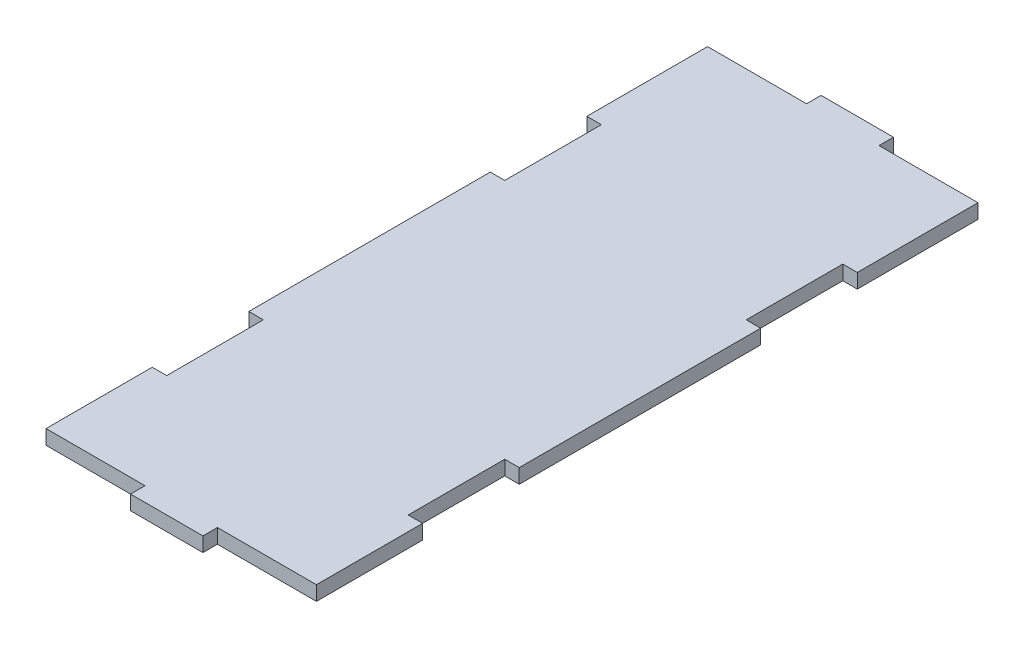
ISO-10303-21;
HEADER;
FILE_DESCRIPTION(('STEP AP214'),'2;1');
FILE_NAME('part.step','',(''),(''),'','','');
FILE_SCHEMA(('AUTOMOTIVE_DESIGN { 1 0 10303 214 1 1 1 1 }'));
ENDSEC;
DATA;
#1=APPLICATION_CONTEXT('core data for automotive mechanical design processes');
#2=APPLICATION_PROTOCOL_DEFINITION('international standard','automotive_design',2000,#1);
#3=PRODUCT_CONTEXT('',#1,'mechanical');
#4=PRODUCT('Part','Part','',(#3));
#5=PRODUCT_RELATED_PRODUCT_CATEGORY('part','',(#4));
#6=PRODUCT_DEFINITION_FORMATION('','',#4);
#7=PRODUCT_DEFINITION_CONTEXT('part definition',#1,'design');
#8=PRODUCT_DEFINITION('design','',#6,#7);
#9=PRODUCT_DEFINITION_SHAPE('','',#8);
#10=(LENGTH_UNIT() NAMED_UNIT(*) SI_UNIT(.MILLI.,.METRE.));
#11=(NAMED_UNIT(*) PLANE_ANGLE_UNIT() SI_UNIT($,.RADIAN.));
#12=(NAMED_UNIT(*) SI_UNIT($,.STERADIAN.) SOLID_ANGLE_UNIT());
#13=UNCERTAINTY_MEASURE_WITH_UNIT(LENGTH_MEASURE(1.E-05),#10,'distance_accuracy_value','');
#14=(GEOMETRIC_REPRESENTATION_CONTEXT(3) GLOBAL_UNCERTAINTY_ASSIGNED_CONTEXT((#13)) GLOBAL_UNIT_ASSIGNED_CONTEXT((#10,
#11,#12)) REPRESENTATION_CONTEXT('',''));
#15=CARTESIAN_POINT('',(0.,0.,0.));
#16=DIRECTION('',(0.,0.,1.));
#17=DIRECTION('',(1.,0.,0.));
#18=AXIS2_PLACEMENT_3D('',#15,#16,#17);
#19=CARTESIAN_POINT('',(-7.50000000000006,91.,0.));
#20=DIRECTION('',(0.,0.,-1.));
#21=DIRECTION('',(-1.,0.,0.));
#22=AXIS2_PLACEMENT_3D('',#19,#20,#21);
#23=PLANE('',#22);
#24=DIRECTION('',(1.,0.,0.));
#25=VECTOR('',#24,1.);
#26=CARTESIAN_POINT('',(-7.50000000000006,88.,0.));
#27=LINE('',#26,#25);
#28=CARTESIAN_POINT('',(-7.50000000000006,88.,0.));
#29=VERTEX_POINT('',#28);
#30=CARTESIAN_POINT('',(7.49999999999994,88.,0.));
#31=VERTEX_POINT('',#30);
#32=EDGE_CURVE('E248',#29,#31,#27,.T.);
#33=ORIENTED_EDGE('',*,*,#32,.T.);
#34=DIRECTION('',(0.,-1.,0.));
#35=VECTOR('',#34,1.);
#36=CARTESIAN_POINT('',(7.49999999999994,91.,0.));
#37=LINE('',#36,#35);
#38=CARTESIAN_POINT('',(7.49999999999994,91.,0.));
#39=VERTEX_POINT('',#38);
#40=EDGE_CURVE('E11',#39,#31,#37,.T.);
#41=ORIENTED_EDGE('',*,*,#40,.F.);
#42=DIRECTION('',(1.,0.,0.));
#43=VECTOR('',#42,1.);
#44=CARTESIAN_POINT('',(-7.50000000000006,91.,0.));
#45=LINE('',#44,#43);
#46=CARTESIAN_POINT('',(-7.50000000000006,91.,0.));
#47=VERTEX_POINT('',#46);
#48=EDGE_CURVE('E302',#47,#39,#45,.T.);
#49=ORIENTED_EDGE('',*,*,#48,.F.);
#50=DIRECTION('',(0.,-1.,0.));
#51=VECTOR('',#50,1.);
#52=CARTESIAN_POINT('',(-7.50000000000006,91.,0.));
#53=LINE('',#52,#51);
#54=EDGE_CURVE('E244',#47,#29,#53,.T.);
#55=ORIENTED_EDGE('',*,*,#54,.T.);
#56=EDGE_LOOP('',(#33,#41,#49,#55));
#57=FACE_BOUND('',#56,.T.);
#58=ADVANCED_FACE('F32',(#57),#23,.F.);
#59=CARTESIAN_POINT('',(7.49999999999994,91.,-3.));
#60=DIRECTION('',(-1.,0.,0.));
#61=DIRECTION('',(0.,-1.,0.));
#62=AXIS2_PLACEMENT_3D('',#59,#60,#61);
#63=PLANE('',#62);
#64=DIRECTION('',(0.,0.,-1.));
#65=VECTOR('',#64,1.);
#66=CARTESIAN_POINT('',(7.49999999999994,88.,-3.));
#67=LINE('',#66,#65);
#68=CARTESIAN_POINT('',(7.49999999999994,88.,-3.));
#69=VERTEX_POINT('',#68);
#70=EDGE_CURVE('E251',#31,#69,#67,.T.);
#71=ORIENTED_EDGE('',*,*,#70,.T.);
#72=DIRECTION('',(0.,-1.,0.));
#73=VECTOR('',#72,1.);
#74=CARTESIAN_POINT('',(7.49999999999994,91.,-3.));
#75=LINE('',#74,#73);
#76=CARTESIAN_POINT('',(7.49999999999994,91.,-3.));
#77=VERTEX_POINT('',#76);
#78=EDGE_CURVE('E40',#77,#69,#75,.T.);
#79=ORIENTED_EDGE('',*,*,#78,.F.);
#80=DIRECTION('',(0.,0.,-1.));
#81=VECTOR('',#80,1.);
#82=CARTESIAN_POINT('',(7.49999999999994,91.,-3.));
#83=LINE('',#82,#81);
#84=EDGE_CURVE('E151',#39,#77,#83,.T.);
#85=ORIENTED_EDGE('',*,*,#84,.F.);
#86=ORIENTED_EDGE('',*,*,#40,.T.);
#87=EDGE_LOOP('',(#71,#79,#85,#86));
#88=FACE_BOUND('',#87,.T.);
#89=ADVANCED_FACE('F460',(#88),#63,.F.);
#90=CARTESIAN_POINT('',(27.9999999999999,91.,-3.));
#91=DIRECTION('',(0.,0.,-1.));
#92=DIRECTION('',(-1.,0.,0.));
#93=AXIS2_PLACEMENT_3D('',#90,#91,#92);
#94=PLANE('',#93);
#95=DIRECTION('',(1.,0.,0.));
#96=VECTOR('',#95,1.);
#97=CARTESIAN_POINT('',(27.9999999999999,88.,-3.));
#98=LINE('',#97,#96);
#99=CARTESIAN_POINT('',(27.9999999999999,88.,-3.));
#100=VERTEX_POINT('',#99);
#101=EDGE_CURVE('E253',#69,#100,#98,.T.);
#102=ORIENTED_EDGE('',*,*,#101,.T.);
#103=DIRECTION('',(0.,-1.,0.));
#104=VECTOR('',#103,1.);
#105=CARTESIAN_POINT('',(27.9999999999999,91.,-3.));
#106=LINE('',#105,#104);
#107=CARTESIAN_POINT('',(27.9999999999999,91.,-3.));
#108=VERTEX_POINT('',#107);
#109=EDGE_CURVE('E369',#108,#100,#106,.T.);
#110=ORIENTED_EDGE('',*,*,#109,.F.);
#111=DIRECTION('',(1.,0.,0.));
#112=VECTOR('',#111,1.);
#113=CARTESIAN_POINT('',(27.9999999999999,91.,-3.));
#114=LINE('',#113,#112);
#115=EDGE_CURVE('E377',#77,#108,#114,.T.);
#116=ORIENTED_EDGE('',*,*,#115,.F.);
#117=ORIENTED_EDGE('',*,*,#78,.T.);
#118=EDGE_LOOP('',(#102,#110,#116,#117));
#119=FACE_BOUND('',#118,.T.);
#120=ADVANCED_FACE('F375',(#119),#94,.F.);
#121=CARTESIAN_POINT('',(27.9999999999999,91.,-3.));
#122=DIRECTION('',(-1.,0.,0.));
#123=DIRECTION('',(0.,-1.,0.));
#124=AXIS2_PLACEMENT_3D('',#121,#122,#123);
#125=PLANE('',#124);
#126=DIRECTION('',(0.,0.,-1.));
#127=VECTOR('',#126,1.);
#128=CARTESIAN_POINT('',(27.9999999999999,88.,-3.));
#129=LINE('',#128,#127);
#130=CARTESIAN_POINT('',(27.9999999999999,88.,-25.));
#131=VERTEX_POINT('',#130);
#132=EDGE_CURVE('E255',#100,#131,#129,.T.);
#133=ORIENTED_EDGE('',*,*,#132,.T.);
#134=DIRECTION('',(0.,-1.,0.));
#135=VECTOR('',#134,1.);
#136=CARTESIAN_POINT('',(27.9999999999999,91.,-25.));
#137=LINE('',#136,#135);
#138=CARTESIAN_POINT('',(27.9999999999999,91.,-25.));
#139=VERTEX_POINT('',#138);
#140=EDGE_CURVE('E366',#139,#131,#137,.T.);
#141=ORIENTED_EDGE('',*,*,#140,.F.);
#142=DIRECTION('',(0.,0.,-1.));
#143=VECTOR('',#142,1.);
#144=CARTESIAN_POINT('',(27.9999999999999,91.,-3.));
#145=LINE('',#144,#143);
#146=EDGE_CURVE('E395',#108,#139,#145,.T.);
#147=ORIENTED_EDGE('',*,*,#146,.F.);
#148=ORIENTED_EDGE('',*,*,#109,.T.);
#149=EDGE_LOOP('',(#133,#141,#147,#148));
#150=FACE_BOUND('',#149,.T.);
#151=ADVANCED_FACE('F386',(#150),#125,.F.);
#152=CARTESIAN_POINT('',(24.9999999999999,91.,-25.));
#153=DIRECTION('',(0.,0.,1.));
#154=DIRECTION('',(1.,0.,0.));
#155=AXIS2_PLACEMENT_3D('',#152,#153,#154);
#156=PLANE('',#155);
#157=DIRECTION('',(-1.,0.,0.));
#158=VECTOR('',#157,1.);
#159=CARTESIAN_POINT('',(24.9999999999999,88.,-25.));
#160=LINE('',#159,#158);
#161=CARTESIAN_POINT('',(24.9999999999999,88.,-25.));
#162=VERTEX_POINT('',#161);
#163=EDGE_CURVE('E257',#131,#162,#160,.T.);
#164=ORIENTED_EDGE('',*,*,#163,.T.);
#165=DIRECTION('',(0.,-1.,0.));
#166=VECTOR('',#165,1.);
#167=CARTESIAN_POINT('',(24.9999999999999,91.,-25.));
#168=LINE('',#167,#166);
#169=CARTESIAN_POINT('',(24.9999999999999,91.,-25.));
#170=VERTEX_POINT('',#169);
#171=EDGE_CURVE('E363',#170,#162,#168,.T.);
#172=ORIENTED_EDGE('',*,*,#171,.F.);
#173=DIRECTION('',(-1.,0.,0.));
#174=VECTOR('',#173,1.);
#175=CARTESIAN_POINT('',(24.9999999999999,91.,-25.));
#176=LINE('',#175,#174);
#177=EDGE_CURVE('E392',#139,#170,#176,.T.);
#178=ORIENTED_EDGE('',*,*,#177,.F.);
#179=ORIENTED_EDGE('',*,*,#140,.T.);
#180=EDGE_LOOP('',(#164,#172,#178,#179));
#181=FACE_BOUND('',#180,.T.);
#182=ADVANCED_FACE('F390',(#181),#156,.F.);
#183=CARTESIAN_POINT('',(24.9999999999999,91.,-45.));
#184=DIRECTION('',(-1.,0.,0.));
#185=DIRECTION('',(0.,0.,1.));
#186=AXIS2_PLACEMENT_3D('',#183,#184,#185);
#187=PLANE('',#186);
#188=DIRECTION('',(0.,0.,-1.));
#189=VECTOR('',#188,1.);
#190=CARTESIAN_POINT('',(24.9999999999999,88.,-45.));
#191=LINE('',#190,#189);
#192=CARTESIAN_POINT('',(24.9999999999999,88.,-45.));
#193=VERTEX_POINT('',#192);
#194=EDGE_CURVE('E259',#162,#193,#191,.T.);
#195=ORIENTED_EDGE('',*,*,#194,.T.);
#196=DIRECTION('',(0.,-1.,0.));
#197=VECTOR('',#196,1.);
#198=CARTESIAN_POINT('',(24.9999999999999,91.,-45.));
#199=LINE('',#198,#197);
#200=CARTESIAN_POINT('',(24.9999999999999,91.,-45.));
#201=VERTEX_POINT('',#200);
#202=EDGE_CURVE('E360',#201,#193,#199,.T.);
#203=ORIENTED_EDGE('',*,*,#202,.F.);
#204=DIRECTION('',(0.,0.,-1.));
#205=VECTOR('',#204,1.);
#206=CARTESIAN_POINT('',(24.9999999999999,91.,-45.));
#207=LINE('',#206,#205);
#208=EDGE_CURVE('E394',#170,#201,#207,.T.);
#209=ORIENTED_EDGE('',*,*,#208,.F.);
#210=ORIENTED_EDGE('',*,*,#171,.T.);
#211=EDGE_LOOP('',(#195,#203,#209,#210));
#212=FACE_BOUND('',#211,.T.);
#213=ADVANCED_FACE('F473',(#212),#187,.F.);
#214=CARTESIAN_POINT('',(27.9999999999999,91.,-45.));
#215=DIRECTION('',(0.,0.,-1.));
#216=DIRECTION('',(-1.,0.,0.));
#217=AXIS2_PLACEMENT_3D('',#214,#215,#216);
#218=PLANE('',#217);
#219=DIRECTION('',(1.,0.,0.));
#220=VECTOR('',#219,1.);
#221=CARTESIAN_POINT('',(27.9999999999999,88.,-45.));
#222=LINE('',#221,#220);
#223=CARTESIAN_POINT('',(27.9999999999999,88.,-45.));
#224=VERTEX_POINT('',#223);
#225=EDGE_CURVE('E261',#193,#224,#222,.T.);
#226=ORIENTED_EDGE('',*,*,#225,.T.);
#227=DIRECTION('',(0.,-1.,0.));
#228=VECTOR('',#227,1.);
#229=CARTESIAN_POINT('',(27.9999999999999,91.,-45.));
#230=LINE('',#229,#228);
#231=CARTESIAN_POINT('',(27.9999999999999,91.,-45.));
#232=VERTEX_POINT('',#231);
#233=EDGE_CURVE('E357',#232,#224,#230,.T.);
#234=ORIENTED_EDGE('',*,*,#233,.F.);
#235=DIRECTION('',(1.,0.,0.));
#236=VECTOR('',#235,1.);
#237=CARTESIAN_POINT('',(27.9999999999999,91.,-45.));
#238=LINE('',#237,#236);
#239=EDGE_CURVE('E397',#201,#232,#238,.T.);
#240=ORIENTED_EDGE('',*,*,#239,.F.);
#241=ORIENTED_EDGE('',*,*,#202,.T.);
#242=EDGE_LOOP('',(#226,#234,#240,#241));
#243=FACE_BOUND('',#242,.T.);
#244=ADVANCED_FACE('F476',(#243),#218,.F.);
#245=CARTESIAN_POINT('',(27.9999999999999,91.,-45.));
#246=DIRECTION('',(-1.,0.,0.));
#247=DIRECTION('',(0.,-1.,0.));
#248=AXIS2_PLACEMENT_3D('',#245,#246,#247);
#249=PLANE('',#248);
#250=DIRECTION('',(0.,0.,-1.));
#251=VECTOR('',#250,1.);
#252=CARTESIAN_POINT('',(27.9999999999999,88.,-45.));
#253=LINE('',#252,#251);
#254=CARTESIAN_POINT('',(27.9999999999999,88.,-95.));
#255=VERTEX_POINT('',#254);
#256=EDGE_CURVE('E263',#224,#255,#253,.T.);
#257=ORIENTED_EDGE('',*,*,#256,.T.);
#258=DIRECTION('',(0.,-1.,0.));
#259=VECTOR('',#258,1.);
#260=CARTESIAN_POINT('',(27.9999999999999,91.,-95.));
#261=LINE('',#260,#259);
#262=CARTESIAN_POINT('',(27.9999999999999,91.,-95.));
#263=VERTEX_POINT('',#262);
#264=EDGE_CURVE('E354',#263,#255,#261,.T.);
#265=ORIENTED_EDGE('',*,*,#264,.F.);
#266=DIRECTION('',(0.,0.,-1.));
#267=VECTOR('',#266,1.);
#268=CARTESIAN_POINT('',(27.9999999999999,91.,-45.));
#269=LINE('',#268,#267);
#270=EDGE_CURVE('E403',#232,#263,#269,.T.);
#271=ORIENTED_EDGE('',*,*,#270,.F.);
#272=ORIENTED_EDGE('',*,*,#233,.T.);
#273=EDGE_LOOP('',(#257,#265,#271,#272));
#274=FACE_BOUND('',#273,.T.);
#275=ADVANCED_FACE('F480',(#274),#249,.F.);
#276=CARTESIAN_POINT('',(24.9999999999999,91.,-95.));
#277=DIRECTION('',(0.,0.,1.));
#278=DIRECTION('',(1.,0.,0.));
#279=AXIS2_PLACEMENT_3D('',#276,#277,#278);
#280=PLANE('',#279);
#281=DIRECTION('',(-1.,0.,0.));
#282=VECTOR('',#281,1.);
#283=CARTESIAN_POINT('',(24.9999999999999,88.,-95.));
#284=LINE('',#283,#282);
#285=CARTESIAN_POINT('',(24.9999999999999,88.,-95.));
#286=VERTEX_POINT('',#285);
#287=EDGE_CURVE('E265',#255,#286,#284,.T.);
#288=ORIENTED_EDGE('',*,*,#287,.T.);
#289=DIRECTION('',(0.,-1.,0.));
#290=VECTOR('',#289,1.);
#291=CARTESIAN_POINT('',(24.9999999999999,91.,-95.));
#292=LINE('',#291,#290);
#293=CARTESIAN_POINT('',(24.9999999999999,91.,-95.));
#294=VERTEX_POINT('',#293);
#295=EDGE_CURVE('E351',#294,#286,#292,.T.);
#296=ORIENTED_EDGE('',*,*,#295,.F.);
#297=DIRECTION('',(-1.,0.,0.));
#298=VECTOR('',#297,1.);
#299=CARTESIAN_POINT('',(24.9999999999999,91.,-95.));
#300=LINE('',#299,#298);
#301=EDGE_CURVE('E405',#263,#294,#300,.T.);
#302=ORIENTED_EDGE('',*,*,#301,.F.);
#303=ORIENTED_EDGE('',*,*,#264,.T.);
#304=EDGE_LOOP('',(#288,#296,#302,#303));
#305=FACE_BOUND('',#304,.T.);
#306=ADVANCED_FACE('F484',(#305),#280,.F.);
#307=CARTESIAN_POINT('',(24.9999999999999,91.,-115.));
#308=DIRECTION('',(-1.,0.,0.));
#309=DIRECTION('',(0.,0.,1.));
#310=AXIS2_PLACEMENT_3D('',#307,#308,#309);
#311=PLANE('',#310);
#312=DIRECTION('',(0.,0.,-1.));
#313=VECTOR('',#312,1.);
#314=CARTESIAN_POINT('',(24.9999999999999,88.,-115.));
#315=LINE('',#314,#313);
#316=CARTESIAN_POINT('',(24.9999999999999,88.,-115.));
#317=VERTEX_POINT('',#316);
#318=EDGE_CURVE('E267',#286,#317,#315,.T.);
#319=ORIENTED_EDGE('',*,*,#318,.T.);
#320=DIRECTION('',(0.,-1.,0.));
#321=VECTOR('',#320,1.);
#322=CARTESIAN_POINT('',(24.9999999999999,91.,-115.));
#323=LINE('',#322,#321);
#324=CARTESIAN_POINT('',(24.9999999999999,91.,-115.));
#325=VERTEX_POINT('',#324);
#326=EDGE_CURVE('E348',#325,#317,#323,.T.);
#327=ORIENTED_EDGE('',*,*,#326,.F.);
#328=DIRECTION('',(0.,0.,-1.));
#329=VECTOR('',#328,1.);
#330=CARTESIAN_POINT('',(24.9999999999999,91.,-115.));
#331=LINE('',#330,#329);
#332=EDGE_CURVE('E407',#294,#325,#331,.T.);
#333=ORIENTED_EDGE('',*,*,#332,.F.);
#334=ORIENTED_EDGE('',*,*,#295,.T.);
#335=EDGE_LOOP('',(#319,#327,#333,#334));
#336=FACE_BOUND('',#335,.T.);
#337=ADVANCED_FACE('F488',(#336),#311,.F.);
#338=CARTESIAN_POINT('',(27.9999999999999,91.,-115.));
#339=DIRECTION('',(0.,0.,-1.));
#340=DIRECTION('',(-1.,0.,0.));
#341=AXIS2_PLACEMENT_3D('',#338,#339,#340);
#342=PLANE('',#341);
#343=DIRECTION('',(1.,0.,0.));
#344=VECTOR('',#343,1.);
#345=CARTESIAN_POINT('',(27.9999999999999,88.,-115.));
#346=LINE('',#345,#344);
#347=CARTESIAN_POINT('',(27.9999999999999,88.,-115.));
#348=VERTEX_POINT('',#347);
#349=EDGE_CURVE('E269',#317,#348,#346,.T.);
#350=ORIENTED_EDGE('',*,*,#349,.T.);
#351=DIRECTION('',(0.,-1.,0.));
#352=VECTOR('',#351,1.);
#353=CARTESIAN_POINT('',(27.9999999999999,91.,-115.));
#354=LINE('',#353,#352);
#355=CARTESIAN_POINT('',(27.9999999999999,91.,-115.));
#356=VERTEX_POINT('',#355);
#357=EDGE_CURVE('E345',#356,#348,#354,.T.);
#358=ORIENTED_EDGE('',*,*,#357,.F.);
#359=DIRECTION('',(1.,0.,0.));
#360=VECTOR('',#359,1.);
#361=CARTESIAN_POINT('',(27.9999999999999,91.,-115.));
#362=LINE('',#361,#360);
#363=EDGE_CURVE('E409',#325,#356,#362,.T.);
#364=ORIENTED_EDGE('',*,*,#363,.F.);
#365=ORIENTED_EDGE('',*,*,#326,.T.);
#366=EDGE_LOOP('',(#350,#358,#364,#365));
#367=FACE_BOUND('',#366,.T.);
#368=ADVANCED_FACE('F492',(#367),#342,.F.);
#369=CARTESIAN_POINT('',(27.9999999999999,91.,-115.));
#370=DIRECTION('',(-1.,0.,0.));
#371=DIRECTION('',(0.,-1.,0.));
#372=AXIS2_PLACEMENT_3D('',#369,#370,#371);
#373=PLANE('',#372);
#374=DIRECTION('',(0.,0.,-1.));
#375=VECTOR('',#374,1.);
#376=CARTESIAN_POINT('',(27.9999999999999,88.,-115.));
#377=LINE('',#376,#375);
#378=CARTESIAN_POINT('',(27.9999999999999,88.,-140.));
#379=VERTEX_POINT('',#378);
#380=EDGE_CURVE('E271',#348,#379,#377,.T.);
#381=ORIENTED_EDGE('',*,*,#380,.T.);
#382=DIRECTION('',(0.,-1.,0.));
#383=VECTOR('',#382,1.);
#384=CARTESIAN_POINT('',(27.9999999999999,91.,-140.));
#385=LINE('',#384,#383);
#386=CARTESIAN_POINT('',(27.9999999999999,91.,-140.));
#387=VERTEX_POINT('',#386);
#388=EDGE_CURVE('E342',#387,#379,#385,.T.);
#389=ORIENTED_EDGE('',*,*,#388,.F.);
#390=DIRECTION('',(0.,0.,-1.));
#391=VECTOR('',#390,1.);
#392=CARTESIAN_POINT('',(27.9999999999999,91.,-115.));
#393=LINE('',#392,#391);
#394=EDGE_CURVE('E411',#356,#387,#393,.T.);
#395=ORIENTED_EDGE('',*,*,#394,.F.);
#396=ORIENTED_EDGE('',*,*,#357,.T.);
#397=EDGE_LOOP('',(#381,#389,#395,#396));
#398=FACE_BOUND('',#397,.T.);
#399=ADVANCED_FACE('F496',(#398),#373,.F.);
#400=CARTESIAN_POINT('',(7.49999999999994,91.,-140.));
#401=DIRECTION('',(0.,0.,1.));
#402=DIRECTION('',(1.,0.,0.));
#403=AXIS2_PLACEMENT_3D('',#400,#401,#402);
#404=PLANE('',#403);
#405=DIRECTION('',(-1.,0.,0.));
#406=VECTOR('',#405,1.);
#407=CARTESIAN_POINT('',(7.49999999999994,88.,-140.));
#408=LINE('',#407,#406);
#409=CARTESIAN_POINT('',(7.49999999999994,88.,-140.));
#410=VERTEX_POINT('',#409);
#411=EDGE_CURVE('E273',#379,#410,#408,.T.);
#412=ORIENTED_EDGE('',*,*,#411,.T.);
#413=DIRECTION('',(0.,-1.,0.));
#414=VECTOR('',#413,1.);
#415=CARTESIAN_POINT('',(7.49999999999994,91.,-140.));
#416=LINE('',#415,#414);
#417=CARTESIAN_POINT('',(7.49999999999994,91.,-140.));
#418=VERTEX_POINT('',#417);
#419=EDGE_CURVE('E339',#418,#410,#416,.T.);
#420=ORIENTED_EDGE('',*,*,#419,.F.);
#421=DIRECTION('',(-1.,0.,0.));
#422=VECTOR('',#421,1.);
#423=CARTESIAN_POINT('',(7.49999999999994,91.,-140.));
#424=LINE('',#423,#422);
#425=EDGE_CURVE('E413',#387,#418,#424,.T.);
#426=ORIENTED_EDGE('',*,*,#425,.F.);
#427=ORIENTED_EDGE('',*,*,#388,.T.);
#428=EDGE_LOOP('',(#412,#420,#426,#427));
#429=FACE_BOUND('',#428,.T.);
#430=ADVANCED_FACE('F500',(#429),#404,.F.);
#431=CARTESIAN_POINT('',(7.49999999999994,91.,-143.));
#432=DIRECTION('',(-1.,0.,0.));
#433=DIRECTION('',(0.,-1.,0.));
#434=AXIS2_PLACEMENT_3D('',#431,#432,#433);
#435=PLANE('',#434);
#436=DIRECTION('',(0.,0.,-1.));
#437=VECTOR('',#436,1.);
#438=CARTESIAN_POINT('',(7.49999999999994,88.,-143.));
#439=LINE('',#438,#437);
#440=CARTESIAN_POINT('',(7.49999999999994,88.,-143.));
#441=VERTEX_POINT('',#440);
#442=EDGE_CURVE('E275',#410,#441,#439,.T.);
#443=ORIENTED_EDGE('',*,*,#442,.T.);
#444=DIRECTION('',(0.,-1.,0.));
#445=VECTOR('',#444,1.);
#446=CARTESIAN_POINT('',(7.49999999999994,91.,-143.));
#447=LINE('',#446,#445);
#448=CARTESIAN_POINT('',(7.49999999999994,91.,-143.));
#449=VERTEX_POINT('',#448);
#450=EDGE_CURVE('E336',#449,#441,#447,.T.);
#451=ORIENTED_EDGE('',*,*,#450,.F.);
#452=DIRECTION('',(0.,0.,-1.));
#453=VECTOR('',#452,1.);
#454=CARTESIAN_POINT('',(7.49999999999994,91.,-143.));
#455=LINE('',#454,#453);
#456=EDGE_CURVE('E415',#418,#449,#455,.T.);
#457=ORIENTED_EDGE('',*,*,#456,.F.);
#458=ORIENTED_EDGE('',*,*,#419,.T.);
#459=EDGE_LOOP('',(#443,#451,#457,#458));
#460=FACE_BOUND('',#459,.T.);
#461=ADVANCED_FACE('F504',(#460),#435,.F.);
#462=CARTESIAN_POINT('',(-7.50000000000006,91.,-143.));
#463=DIRECTION('',(0.,0.,1.));
#464=DIRECTION('',(1.,0.,0.));
#465=AXIS2_PLACEMENT_3D('',#462,#463,#464);
#466=PLANE('',#465);
#467=DIRECTION('',(-1.,0.,0.));
#468=VECTOR('',#467,1.);
#469=CARTESIAN_POINT('',(-7.50000000000006,88.,-143.));
#470=LINE('',#469,#468);
#471=CARTESIAN_POINT('',(-7.50000000000006,88.,-143.));
#472=VERTEX_POINT('',#471);
#473=EDGE_CURVE('E277',#441,#472,#470,.T.);
#474=ORIENTED_EDGE('',*,*,#473,.T.);
#475=DIRECTION('',(0.,-1.,0.));
#476=VECTOR('',#475,1.);
#477=CARTESIAN_POINT('',(-7.50000000000006,91.,-143.));
#478=LINE('',#477,#476);
#479=CARTESIAN_POINT('',(-7.50000000000006,91.,-143.));
#480=VERTEX_POINT('',#479);
#481=EDGE_CURVE('E333',#480,#472,#478,.T.);
#482=ORIENTED_EDGE('',*,*,#481,.F.);
#483=DIRECTION('',(-1.,0.,0.));
#484=VECTOR('',#483,1.);
#485=CARTESIAN_POINT('',(-7.50000000000006,91.,-143.));
#486=LINE('',#485,#484);
#487=EDGE_CURVE('E417',#449,#480,#486,.T.);
#488=ORIENTED_EDGE('',*,*,#487,.F.);
#489=ORIENTED_EDGE('',*,*,#450,.T.);
#490=EDGE_LOOP('',(#474,#482,#488,#489));
#491=FACE_BOUND('',#490,.T.);
#492=ADVANCED_FACE('F508',(#491),#466,.F.);
#493=CARTESIAN_POINT('',(-7.50000000000006,91.,-140.));
#494=DIRECTION('',(1.,0.,0.));
#495=DIRECTION('',(0.,1.,0.));
#496=AXIS2_PLACEMENT_3D('',#493,#494,#495);
#497=PLANE('',#496);
#498=DIRECTION('',(0.,0.,1.));
#499=VECTOR('',#498,1.);
#500=CARTESIAN_POINT('',(-7.50000000000006,88.,-140.));
#501=LINE('',#500,#499);
#502=CARTESIAN_POINT('',(-7.50000000000006,88.,-140.));
#503=VERTEX_POINT('',#502);
#504=EDGE_CURVE('E279',#472,#503,#501,.T.);
#505=ORIENTED_EDGE('',*,*,#504,.T.);
#506=DIRECTION('',(0.,-1.,0.));
#507=VECTOR('',#506,1.);
#508=CARTESIAN_POINT('',(-7.50000000000006,91.,-140.));
#509=LINE('',#508,#507);
#510=CARTESIAN_POINT('',(-7.50000000000006,91.,-140.));
#511=VERTEX_POINT('',#510);
#512=EDGE_CURVE('E330',#511,#503,#509,.T.);
#513=ORIENTED_EDGE('',*,*,#512,.F.);
#514=DIRECTION('',(0.,0.,1.));
#515=VECTOR('',#514,1.);
#516=CARTESIAN_POINT('',(-7.50000000000006,91.,-140.));
#517=LINE('',#516,#515);
#518=EDGE_CURVE('E419',#480,#511,#517,.T.);
#519=ORIENTED_EDGE('',*,*,#518,.F.);
#520=ORIENTED_EDGE('',*,*,#481,.T.);
#521=EDGE_LOOP('',(#505,#513,#519,#520));
#522=FACE_BOUND('',#521,.T.);
#523=ADVANCED_FACE('F512',(#522),#497,.F.);
#524=CARTESIAN_POINT('',(-28.0000000000001,91.,-140.));
#525=DIRECTION('',(0.,0.,1.));
#526=DIRECTION('',(1.,0.,0.));
#527=AXIS2_PLACEMENT_3D('',#524,#525,#526);
#528=PLANE('',#527);
#529=DIRECTION('',(-1.,0.,0.));
#530=VECTOR('',#529,1.);
#531=CARTESIAN_POINT('',(-28.0000000000001,88.,-140.));
#532=LINE('',#531,#530);
#533=CARTESIAN_POINT('',(-28.0000000000001,88.,-140.));
#534=VERTEX_POINT('',#533);
#535=EDGE_CURVE('E281',#503,#534,#532,.T.);
#536=ORIENTED_EDGE('',*,*,#535,.T.);
#537=DIRECTION('',(0.,-1.,0.));
#538=VECTOR('',#537,1.);
#539=CARTESIAN_POINT('',(-28.0000000000001,91.,-140.));
#540=LINE('',#539,#538);
#541=CARTESIAN_POINT('',(-28.0000000000001,91.,-140.));
#542=VERTEX_POINT('',#541);
#543=EDGE_CURVE('E327',#542,#534,#540,.T.);
#544=ORIENTED_EDGE('',*,*,#543,.F.);
#545=DIRECTION('',(-1.,0.,0.));
#546=VECTOR('',#545,1.);
#547=CARTESIAN_POINT('',(-28.0000000000001,91.,-140.));
#548=LINE('',#547,#546);
#549=EDGE_CURVE('E421',#511,#542,#548,.T.);
#550=ORIENTED_EDGE('',*,*,#549,.F.);
#551=ORIENTED_EDGE('',*,*,#512,.T.);
#552=EDGE_LOOP('',(#536,#544,#550,#551));
#553=FACE_BOUND('',#552,.T.);
#554=ADVANCED_FACE('F516',(#553),#528,.F.);
#555=CARTESIAN_POINT('',(-28.0000000000001,91.,-115.));
#556=DIRECTION('',(1.,0.,0.));
#557=DIRECTION('',(0.,1.,0.));
#558=AXIS2_PLACEMENT_3D('',#555,#556,#557);
#559=PLANE('',#558);
#560=DIRECTION('',(0.,0.,1.));
#561=VECTOR('',#560,1.);
#562=CARTESIAN_POINT('',(-28.0000000000001,88.,-115.));
#563=LINE('',#562,#561);
#564=CARTESIAN_POINT('',(-28.0000000000001,88.,-115.));
#565=VERTEX_POINT('',#564);
#566=EDGE_CURVE('E283',#534,#565,#563,.T.);
#567=ORIENTED_EDGE('',*,*,#566,.T.);
#568=DIRECTION('',(0.,-1.,0.));
#569=VECTOR('',#568,1.);
#570=CARTESIAN_POINT('',(-28.0000000000001,91.,-115.));
#571=LINE('',#570,#569);
#572=CARTESIAN_POINT('',(-28.0000000000001,91.,-115.));
#573=VERTEX_POINT('',#572);
#574=EDGE_CURVE('E324',#573,#565,#571,.T.);
#575=ORIENTED_EDGE('',*,*,#574,.F.);
#576=DIRECTION('',(0.,0.,1.));
#577=VECTOR('',#576,1.);
#578=CARTESIAN_POINT('',(-28.0000000000001,91.,-115.));
#579=LINE('',#578,#577);
#580=EDGE_CURVE('E423',#542,#573,#579,.T.);
#581=ORIENTED_EDGE('',*,*,#580,.F.);
#582=ORIENTED_EDGE('',*,*,#543,.T.);
#583=EDGE_LOOP('',(#567,#575,#581,#582));
#584=FACE_BOUND('',#583,.T.);
#585=ADVANCED_FACE('F520',(#584),#559,.F.);
#586=CARTESIAN_POINT('',(-25.0000000000001,91.,-115.));
#587=DIRECTION('',(0.,0.,-1.));
#588=DIRECTION('',(-1.,0.,0.));
#589=AXIS2_PLACEMENT_3D('',#586,#587,#588);
#590=PLANE('',#589);
#591=DIRECTION('',(1.,0.,0.));
#592=VECTOR('',#591,1.);
#593=CARTESIAN_POINT('',(-25.0000000000001,88.,-115.));
#594=LINE('',#593,#592);
#595=CARTESIAN_POINT('',(-25.0000000000001,88.,-115.));
#596=VERTEX_POINT('',#595);
#597=EDGE_CURVE('E285',#565,#596,#594,.T.);
#598=ORIENTED_EDGE('',*,*,#597,.T.);
#599=DIRECTION('',(0.,-1.,0.));
#600=VECTOR('',#599,1.);
#601=CARTESIAN_POINT('',(-25.0000000000001,91.,-115.));
#602=LINE('',#601,#600);
#603=CARTESIAN_POINT('',(-25.0000000000001,91.,-115.));
#604=VERTEX_POINT('',#603);
#605=EDGE_CURVE('E321',#604,#596,#602,.T.);
#606=ORIENTED_EDGE('',*,*,#605,.F.);
#607=DIRECTION('',(1.,0.,0.));
#608=VECTOR('',#607,1.);
#609=CARTESIAN_POINT('',(-25.0000000000001,91.,-115.));
#610=LINE('',#609,#608);
#611=EDGE_CURVE('E425',#573,#604,#610,.T.);
#612=ORIENTED_EDGE('',*,*,#611,.F.);
#613=ORIENTED_EDGE('',*,*,#574,.T.);
#614=EDGE_LOOP('',(#598,#606,#612,#613));
#615=FACE_BOUND('',#614,.T.);
#616=ADVANCED_FACE('F524',(#615),#590,.F.);
#617=CARTESIAN_POINT('',(-25.0000000000001,91.,-95.));
#618=DIRECTION('',(1.,0.,0.));
#619=DIRECTION('',(0.,1.,0.));
#620=AXIS2_PLACEMENT_3D('',#617,#618,#619);
#621=PLANE('',#620);
#622=DIRECTION('',(0.,0.,1.));
#623=VECTOR('',#622,1.);
#624=CARTESIAN_POINT('',(-25.0000000000001,88.,-95.));
#625=LINE('',#624,#623);
#626=CARTESIAN_POINT('',(-25.0000000000001,88.,-95.));
#627=VERTEX_POINT('',#626);
#628=EDGE_CURVE('E287',#596,#627,#625,.T.);
#629=ORIENTED_EDGE('',*,*,#628,.T.);
#630=DIRECTION('',(0.,-1.,0.));
#631=VECTOR('',#630,1.);
#632=CARTESIAN_POINT('',(-25.0000000000001,91.,-95.));
#633=LINE('',#632,#631);
#634=CARTESIAN_POINT('',(-25.0000000000001,91.,-95.));
#635=VERTEX_POINT('',#634);
#636=EDGE_CURVE('E318',#635,#627,#633,.T.);
#637=ORIENTED_EDGE('',*,*,#636,.F.);
#638=DIRECTION('',(0.,0.,1.));
#639=VECTOR('',#638,1.);
#640=CARTESIAN_POINT('',(-25.0000000000001,91.,-95.));
#641=LINE('',#640,#639);
#642=EDGE_CURVE('E427',#604,#635,#641,.T.);
#643=ORIENTED_EDGE('',*,*,#642,.F.);
#644=ORIENTED_EDGE('',*,*,#605,.T.);
#645=EDGE_LOOP('',(#629,#637,#643,#644));
#646=FACE_BOUND('',#645,.T.);
#647=ADVANCED_FACE('F528',(#646),#621,.F.);
#648=CARTESIAN_POINT('',(-28.0000000000001,91.,-95.));
#649=DIRECTION('',(0.,0.,1.));
#650=DIRECTION('',(1.,0.,0.));
#651=AXIS2_PLACEMENT_3D('',#648,#649,#650);
#652=PLANE('',#651);
#653=DIRECTION('',(-1.,0.,0.));
#654=VECTOR('',#653,1.);
#655=CARTESIAN_POINT('',(-28.0000000000001,88.,-95.));
#656=LINE('',#655,#654);
#657=CARTESIAN_POINT('',(-28.0000000000001,88.,-95.));
#658=VERTEX_POINT('',#657);
#659=EDGE_CURVE('E289',#627,#658,#656,.T.);
#660=ORIENTED_EDGE('',*,*,#659,.T.);
#661=DIRECTION('',(0.,-1.,0.));
#662=VECTOR('',#661,1.);
#663=CARTESIAN_POINT('',(-28.0000000000001,91.,-95.));
#664=LINE('',#663,#662);
#665=CARTESIAN_POINT('',(-28.0000000000001,91.,-95.));
#666=VERTEX_POINT('',#665);
#667=EDGE_CURVE('E315',#666,#658,#664,.T.);
#668=ORIENTED_EDGE('',*,*,#667,.F.);
#669=DIRECTION('',(-1.,0.,0.));
#670=VECTOR('',#669,1.);
#671=CARTESIAN_POINT('',(-28.0000000000001,91.,-95.));
#672=LINE('',#671,#670);
#673=EDGE_CURVE('E429',#635,#666,#672,.T.);
#674=ORIENTED_EDGE('',*,*,#673,.F.);
#675=ORIENTED_EDGE('',*,*,#636,.T.);
#676=EDGE_LOOP('',(#660,#668,#674,#675));
#677=FACE_BOUND('',#676,.T.);
#678=ADVANCED_FACE('F532',(#677),#652,.F.);
#679=CARTESIAN_POINT('',(-28.0000000000001,91.,-45.));
#680=DIRECTION('',(1.,0.,0.));
#681=DIRECTION('',(0.,1.,0.));
#682=AXIS2_PLACEMENT_3D('',#679,#680,#681);
#683=PLANE('',#682);
#684=DIRECTION('',(0.,0.,1.));
#685=VECTOR('',#684,1.);
#686=CARTESIAN_POINT('',(-28.0000000000001,88.,-45.));
#687=LINE('',#686,#685);
#688=CARTESIAN_POINT('',(-28.0000000000001,88.,-45.));
#689=VERTEX_POINT('',#688);
#690=EDGE_CURVE('E291',#658,#689,#687,.T.);
#691=ORIENTED_EDGE('',*,*,#690,.T.);
#692=DIRECTION('',(0.,-1.,0.));
#693=VECTOR('',#692,1.);
#694=CARTESIAN_POINT('',(-28.0000000000001,91.,-45.));
#695=LINE('',#694,#693);
#696=CARTESIAN_POINT('',(-28.0000000000001,91.,-45.));
#697=VERTEX_POINT('',#696);
#698=EDGE_CURVE('E312',#697,#689,#695,.T.);
#699=ORIENTED_EDGE('',*,*,#698,.F.);
#700=DIRECTION('',(0.,0.,1.));
#701=VECTOR('',#700,1.);
#702=CARTESIAN_POINT('',(-28.0000000000001,91.,-45.));
#703=LINE('',#702,#701);
#704=EDGE_CURVE('E431',#666,#697,#703,.T.);
#705=ORIENTED_EDGE('',*,*,#704,.F.);
#706=ORIENTED_EDGE('',*,*,#667,.T.);
#707=EDGE_LOOP('',(#691,#699,#705,#706));
#708=FACE_BOUND('',#707,.T.);
#709=ADVANCED_FACE('F536',(#708),#683,.F.);
#710=CARTESIAN_POINT('',(-25.0000000000001,91.,-45.));
#711=DIRECTION('',(0.,0.,-1.));
#712=DIRECTION('',(-1.,0.,0.));
#713=AXIS2_PLACEMENT_3D('',#710,#711,#712);
#714=PLANE('',#713);
#715=DIRECTION('',(1.,0.,0.));
#716=VECTOR('',#715,1.);
#717=CARTESIAN_POINT('',(-25.0000000000001,88.,-45.));
#718=LINE('',#717,#716);
#719=CARTESIAN_POINT('',(-25.0000000000001,88.,-45.));
#720=VERTEX_POINT('',#719);
#721=EDGE_CURVE('E293',#689,#720,#718,.T.);
#722=ORIENTED_EDGE('',*,*,#721,.T.);
#723=DIRECTION('',(0.,-1.,0.));
#724=VECTOR('',#723,1.);
#725=CARTESIAN_POINT('',(-25.0000000000001,91.,-45.));
#726=LINE('',#725,#724);
#727=CARTESIAN_POINT('',(-25.0000000000001,91.,-45.));
#728=VERTEX_POINT('',#727);
#729=EDGE_CURVE('E309',#728,#720,#726,.T.);
#730=ORIENTED_EDGE('',*,*,#729,.F.);
#731=DIRECTION('',(1.,0.,0.));
#732=VECTOR('',#731,1.);
#733=CARTESIAN_POINT('',(-25.0000000000001,91.,-45.));
#734=LINE('',#733,#732);
#735=EDGE_CURVE('E433',#697,#728,#734,.T.);
#736=ORIENTED_EDGE('',*,*,#735,.F.);
#737=ORIENTED_EDGE('',*,*,#698,.T.);
#738=EDGE_LOOP('',(#722,#730,#736,#737));
#739=FACE_BOUND('',#738,.T.);
#740=ADVANCED_FACE('F540',(#739),#714,.F.);
#741=CARTESIAN_POINT('',(-25.0000000000001,91.,-25.));
#742=DIRECTION('',(1.,0.,0.));
#743=DIRECTION('',(0.,1.,0.));
#744=AXIS2_PLACEMENT_3D('',#741,#742,#743);
#745=PLANE('',#744);
#746=DIRECTION('',(0.,0.,1.));
#747=VECTOR('',#746,1.);
#748=CARTESIAN_POINT('',(-25.0000000000001,88.,-25.));
#749=LINE('',#748,#747);
#750=CARTESIAN_POINT('',(-25.0000000000001,88.,-25.));
#751=VERTEX_POINT('',#750);
#752=EDGE_CURVE('E295',#720,#751,#749,.T.);
#753=ORIENTED_EDGE('',*,*,#752,.T.);
#754=DIRECTION('',(0.,-1.,0.));
#755=VECTOR('',#754,1.);
#756=CARTESIAN_POINT('',(-25.0000000000001,91.,-25.));
#757=LINE('',#756,#755);
#758=CARTESIAN_POINT('',(-25.0000000000001,91.,-25.));
#759=VERTEX_POINT('',#758);
#760=EDGE_CURVE('E306',#759,#751,#757,.T.);
#761=ORIENTED_EDGE('',*,*,#760,.F.);
#762=DIRECTION('',(0.,0.,1.));
#763=VECTOR('',#762,1.);
#764=CARTESIAN_POINT('',(-25.0000000000001,91.,-25.));
#765=LINE('',#764,#763);
#766=EDGE_CURVE('E435',#728,#759,#765,.T.);
#767=ORIENTED_EDGE('',*,*,#766,.F.);
#768=ORIENTED_EDGE('',*,*,#729,.T.);
#769=EDGE_LOOP('',(#753,#761,#767,#768));
#770=FACE_BOUND('',#769,.T.);
#771=ADVANCED_FACE('F441',(#770),#745,.F.);
#772=CARTESIAN_POINT('',(-28.0000000000001,91.,-25.));
#773=DIRECTION('',(0.,0.,1.));
#774=DIRECTION('',(1.,0.,0.));
#775=AXIS2_PLACEMENT_3D('',#772,#773,#774);
#776=PLANE('',#775);
#777=DIRECTION('',(-1.,0.,0.));
#778=VECTOR('',#777,1.);
#779=CARTESIAN_POINT('',(-28.0000000000001,88.,-25.));
#780=LINE('',#779,#778);
#781=CARTESIAN_POINT('',(-28.0000000000001,88.,-25.));
#782=VERTEX_POINT('',#781);
#783=EDGE_CURVE('E297',#751,#782,#780,.T.);
#784=ORIENTED_EDGE('',*,*,#783,.T.);
#785=DIRECTION('',(0.,-1.,0.));
#786=VECTOR('',#785,1.);
#787=CARTESIAN_POINT('',(-28.0000000000001,91.,-25.));
#788=LINE('',#787,#786);
#789=CARTESIAN_POINT('',(-28.0000000000001,91.,-25.));
#790=VERTEX_POINT('',#789);
#791=EDGE_CURVE('E239',#790,#782,#788,.T.);
#792=ORIENTED_EDGE('',*,*,#791,.F.);
#793=DIRECTION('',(-1.,0.,0.));
#794=VECTOR('',#793,1.);
#795=CARTESIAN_POINT('',(-28.0000000000001,91.,-25.));
#796=LINE('',#795,#794);
#797=EDGE_CURVE('E230',#759,#790,#796,.T.);
#798=ORIENTED_EDGE('',*,*,#797,.F.);
#799=ORIENTED_EDGE('',*,*,#760,.T.);
#800=EDGE_LOOP('',(#784,#792,#798,#799));
#801=FACE_BOUND('',#800,.T.);
#802=ADVANCED_FACE('F445',(#801),#776,.F.);
#803=CARTESIAN_POINT('',(-28.0000000000001,91.,-2.99999999999999));
#804=DIRECTION('',(1.,0.,0.));
#805=DIRECTION('',(0.,0.,-1.));
#806=AXIS2_PLACEMENT_3D('',#803,#804,#805);
#807=PLANE('',#806);
#808=DIRECTION('',(0.,0.,1.));
#809=VECTOR('',#808,1.);
#810=CARTESIAN_POINT('',(-28.0000000000001,88.,-2.99999999999999));
#811=LINE('',#810,#809);
#812=CARTESIAN_POINT('',(-28.0000000000001,88.,-2.99999999999999));
#813=VERTEX_POINT('',#812);
#814=EDGE_CURVE('E238',#782,#813,#811,.T.);
#815=ORIENTED_EDGE('',*,*,#814,.T.);
#816=DIRECTION('',(0.,-1.,0.));
#817=VECTOR('',#816,1.);
#818=CARTESIAN_POINT('',(-28.0000000000001,91.,-2.99999999999999));
#819=LINE('',#818,#817);
#820=CARTESIAN_POINT('',(-28.0000000000001,91.,-2.99999999999999));
#821=VERTEX_POINT('',#820);
#822=EDGE_CURVE('E235',#821,#813,#819,.T.);
#823=ORIENTED_EDGE('',*,*,#822,.F.);
#824=DIRECTION('',(0.,0.,1.));
#825=VECTOR('',#824,1.);
#826=CARTESIAN_POINT('',(-28.0000000000001,91.,-2.99999999999999));
#827=LINE('',#826,#825);
#828=EDGE_CURVE('E224',#790,#821,#827,.T.);
#829=ORIENTED_EDGE('',*,*,#828,.F.);
#830=ORIENTED_EDGE('',*,*,#791,.T.);
#831=EDGE_LOOP('',(#815,#823,#829,#830));
#832=FACE_BOUND('',#831,.T.);
#833=ADVANCED_FACE('F236',(#832),#807,.F.);
#834=CARTESIAN_POINT('',(-7.50000000000007,91.,-3.));
#835=DIRECTION('',(0.,0.,-1.));
#836=DIRECTION('',(-1.,0.,0.));
#837=AXIS2_PLACEMENT_3D('',#834,#835,#836);
#838=PLANE('',#837);
#839=DIRECTION('',(1.,0.,0.));
#840=VECTOR('',#839,1.);
#841=CARTESIAN_POINT('',(-7.50000000000007,88.,-3.));
#842=LINE('',#841,#840);
#843=CARTESIAN_POINT('',(-7.50000000000007,88.,-3.));
#844=VERTEX_POINT('',#843);
#845=EDGE_CURVE('E137',#813,#844,#842,.T.);
#846=ORIENTED_EDGE('',*,*,#845,.T.);
#847=DIRECTION('',(0.,-1.,0.));
#848=VECTOR('',#847,1.);
#849=CARTESIAN_POINT('',(-7.50000000000007,91.,-3.));
#850=LINE('',#849,#848);
#851=CARTESIAN_POINT('',(-7.50000000000007,91.,-3.));
#852=VERTEX_POINT('',#851);
#853=EDGE_CURVE('E240',#852,#844,#850,.T.);
#854=ORIENTED_EDGE('',*,*,#853,.F.);
#855=DIRECTION('',(1.,0.,0.));
#856=VECTOR('',#855,1.);
#857=CARTESIAN_POINT('',(-7.50000000000007,91.,-3.));
#858=LINE('',#857,#856);
#859=EDGE_CURVE('E228',#821,#852,#858,.T.);
#860=ORIENTED_EDGE('',*,*,#859,.F.);
#861=ORIENTED_EDGE('',*,*,#822,.T.);
#862=EDGE_LOOP('',(#846,#854,#860,#861));
#863=FACE_BOUND('',#862,.T.);
#864=ADVANCED_FACE('F242',(#863),#838,.F.);
#865=CARTESIAN_POINT('',(-7.50000000000006,91.,0.));
#866=DIRECTION('',(1.,0.,0.));
#867=DIRECTION('',(0.,0.,-1.));
#868=AXIS2_PLACEMENT_3D('',#865,#866,#867);
#869=PLANE('',#868);
#870=DIRECTION('',(0.,0.,1.));
#871=VECTOR('',#870,1.);
#872=CARTESIAN_POINT('',(-7.50000000000006,88.,0.));
#873=LINE('',#872,#871);
#874=EDGE_CURVE('E143',#844,#29,#873,.T.);
#875=ORIENTED_EDGE('',*,*,#874,.T.);
#876=ORIENTED_EDGE('',*,*,#54,.F.);
#877=DIRECTION('',(0.,0.,1.));
#878=VECTOR('',#877,1.);
#879=CARTESIAN_POINT('',(-7.50000000000006,91.,0.));
#880=LINE('',#879,#878);
#881=EDGE_CURVE('E48',#852,#47,#880,.T.);
#882=ORIENTED_EDGE('',*,*,#881,.F.);
#883=ORIENTED_EDGE('',*,*,#853,.T.);
#884=EDGE_LOOP('',(#875,#876,#882,#883));
#885=FACE_BOUND('',#884,.T.);
#886=ADVANCED_FACE('F449',(#885),#869,.F.);
#887=CARTESIAN_POINT('',(0.,91.,0.));
#888=DIRECTION('',(0.,-1.,0.));
#889=DIRECTION('',(0.,0.,-1.));
#890=AXIS2_PLACEMENT_3D('',#887,#888,#889);
#891=PLANE('',#890);
#892=ORIENTED_EDGE('',*,*,#48,.T.);
#893=ORIENTED_EDGE('',*,*,#84,.T.);
#894=ORIENTED_EDGE('',*,*,#115,.T.);
#895=ORIENTED_EDGE('',*,*,#146,.T.);
#896=ORIENTED_EDGE('',*,*,#177,.T.);
#897=ORIENTED_EDGE('',*,*,#208,.T.);
#898=ORIENTED_EDGE('',*,*,#239,.T.);
#899=ORIENTED_EDGE('',*,*,#270,.T.);
#900=ORIENTED_EDGE('',*,*,#301,.T.);
#901=ORIENTED_EDGE('',*,*,#332,.T.);
#902=ORIENTED_EDGE('',*,*,#363,.T.);
#903=ORIENTED_EDGE('',*,*,#394,.T.);
#904=ORIENTED_EDGE('',*,*,#425,.T.);
#905=ORIENTED_EDGE('',*,*,#456,.T.);
#906=ORIENTED_EDGE('',*,*,#487,.T.);
#907=ORIENTED_EDGE('',*,*,#518,.T.);
#908=ORIENTED_EDGE('',*,*,#549,.T.);
#909=ORIENTED_EDGE('',*,*,#580,.T.);
#910=ORIENTED_EDGE('',*,*,#611,.T.);
#911=ORIENTED_EDGE('',*,*,#642,.T.);
#912=ORIENTED_EDGE('',*,*,#673,.T.);
#913=ORIENTED_EDGE('',*,*,#704,.T.);
#914=ORIENTED_EDGE('',*,*,#735,.T.);
#915=ORIENTED_EDGE('',*,*,#766,.T.);
#916=ORIENTED_EDGE('',*,*,#797,.T.);
#917=ORIENTED_EDGE('',*,*,#828,.T.);
#918=ORIENTED_EDGE('',*,*,#859,.T.);
#919=ORIENTED_EDGE('',*,*,#881,.T.);
#920=EDGE_LOOP('',(#892,#893,#894,#895,#896,#897,#898,#899,#900,#901,#902,#903,#904,#905,#906,
#907,#908,#909,#910,#911,#912,#913,#914,#915,#916,#917,#918,#919));
#921=FACE_BOUND('',#920,.T.);
#922=ADVANCED_FACE('F226',(#921),#891,.F.);
#923=CARTESIAN_POINT('',(0.,88.,0.));
#924=DIRECTION('',(0.,-1.,0.));
#925=DIRECTION('',(0.,0.,-1.));
#926=AXIS2_PLACEMENT_3D('',#923,#924,#925);
#927=PLANE('',#926);
#928=ORIENTED_EDGE('',*,*,#32,.F.);
#929=ORIENTED_EDGE('',*,*,#874,.F.);
#930=ORIENTED_EDGE('',*,*,#845,.F.);
#931=ORIENTED_EDGE('',*,*,#814,.F.);
#932=ORIENTED_EDGE('',*,*,#783,.F.);
#933=ORIENTED_EDGE('',*,*,#752,.F.);
#934=ORIENTED_EDGE('',*,*,#721,.F.);
#935=ORIENTED_EDGE('',*,*,#690,.F.);
#936=ORIENTED_EDGE('',*,*,#659,.F.);
#937=ORIENTED_EDGE('',*,*,#628,.F.);
#938=ORIENTED_EDGE('',*,*,#597,.F.);
#939=ORIENTED_EDGE('',*,*,#566,.F.);
#940=ORIENTED_EDGE('',*,*,#535,.F.);
#941=ORIENTED_EDGE('',*,*,#504,.F.);
#942=ORIENTED_EDGE('',*,*,#473,.F.);
#943=ORIENTED_EDGE('',*,*,#442,.F.);
#944=ORIENTED_EDGE('',*,*,#411,.F.);
#945=ORIENTED_EDGE('',*,*,#380,.F.);
#946=ORIENTED_EDGE('',*,*,#349,.F.);
#947=ORIENTED_EDGE('',*,*,#318,.F.);
#948=ORIENTED_EDGE('',*,*,#287,.F.);
#949=ORIENTED_EDGE('',*,*,#256,.F.);
#950=ORIENTED_EDGE('',*,*,#225,.F.);
#951=ORIENTED_EDGE('',*,*,#194,.F.);
#952=ORIENTED_EDGE('',*,*,#163,.F.);
#953=ORIENTED_EDGE('',*,*,#132,.F.);
#954=ORIENTED_EDGE('',*,*,#101,.F.);
#955=ORIENTED_EDGE('',*,*,#70,.F.);
#956=EDGE_LOOP('',(#928,#929,#930,#931,#932,#933,#934,#935,#936,#937,#938,#939,#940,#941,#942,
#943,#944,#945,#946,#947,#948,#949,#950,#951,#952,#953,#954,#955));
#957=FACE_BOUND('',#956,.T.);
#958=ADVANCED_FACE('F381',(#957),#927,.T.);
#959=CLOSED_SHELL('',(#58,#89,#120,#151,#182,#213,#244,#275,#306,#337,#368,#399,#430,#461,#492,
#523,#554,#585,#616,#647,#678,#709,#740,#771,#802,#833,#864,#886,#922,#958));
#960=MANIFOLD_SOLID_BREP('B2',#959);
#961=ADVANCED_BREP_SHAPE_REPRESENTATION('',(#18,#960),#14);
#962=SHAPE_DEFINITION_REPRESENTATION(#9,#961);
ENDSEC;
END-ISO-10303-21;
